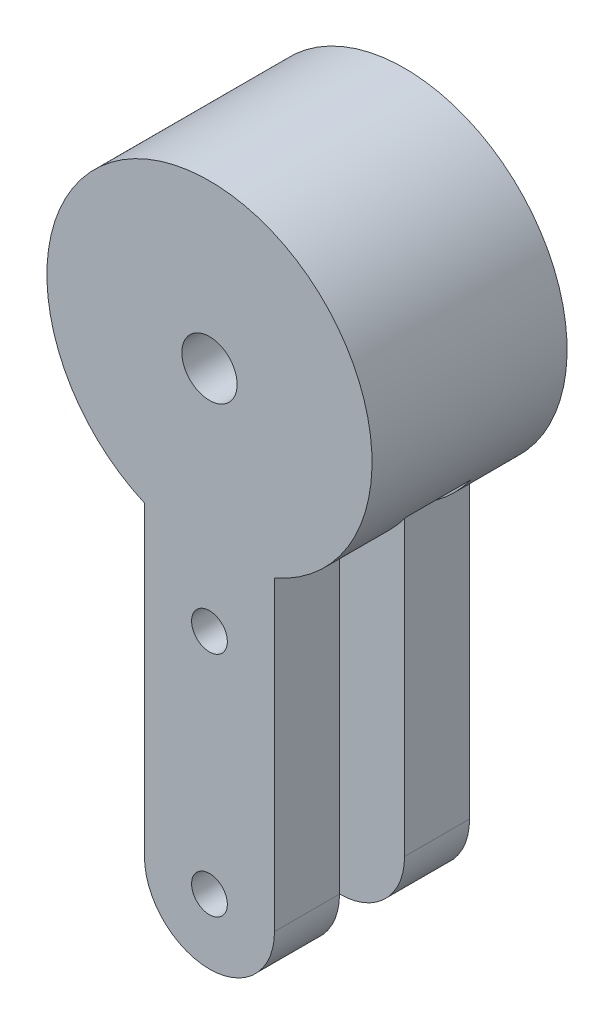
ISO-10303-21;
HEADER;
FILE_DESCRIPTION(('STEP AP214'),'2;1');
FILE_NAME('part.step','',(''),(''),'','','');
FILE_SCHEMA(('AUTOMOTIVE_DESIGN { 1 0 10303 214 1 1 1 1 }'));
ENDSEC;
DATA;
#1=APPLICATION_CONTEXT('core data for automotive mechanical design processes');
#2=APPLICATION_PROTOCOL_DEFINITION('international standard','automotive_design',2000,#1);
#3=PRODUCT_CONTEXT('',#1,'mechanical');
#4=PRODUCT('Part','Part','',(#3));
#5=PRODUCT_RELATED_PRODUCT_CATEGORY('part','',(#4));
#6=PRODUCT_DEFINITION_FORMATION('','',#4);
#7=PRODUCT_DEFINITION_CONTEXT('part definition',#1,'design');
#8=PRODUCT_DEFINITION('design','',#6,#7);
#9=PRODUCT_DEFINITION_SHAPE('','',#8);
#10=(LENGTH_UNIT() NAMED_UNIT(*) SI_UNIT(.MILLI.,.METRE.));
#11=(NAMED_UNIT(*) PLANE_ANGLE_UNIT() SI_UNIT($,.RADIAN.));
#12=(NAMED_UNIT(*) SI_UNIT($,.STERADIAN.) SOLID_ANGLE_UNIT());
#13=UNCERTAINTY_MEASURE_WITH_UNIT(LENGTH_MEASURE(1.E-05),#10,'distance_accuracy_value','');
#14=(GEOMETRIC_REPRESENTATION_CONTEXT(3) GLOBAL_UNCERTAINTY_ASSIGNED_CONTEXT((#13)) GLOBAL_UNIT_ASSIGNED_CONTEXT((#10,
#11,#12)) REPRESENTATION_CONTEXT('',''));
#15=CARTESIAN_POINT('',(0.,0.,0.));
#16=DIRECTION('',(0.,0.,1.));
#17=DIRECTION('',(1.,0.,0.));
#18=AXIS2_PLACEMENT_3D('',#15,#16,#17);
#19=CARTESIAN_POINT('',(0.,260.,10.));
#20=DIRECTION('',(0.,0.,-1.));
#21=DIRECTION('',(-1.,0.,0.));
#22=AXIS2_PLACEMENT_3D('',#19,#20,#21);
#23=CYLINDRICAL_SURFACE('',#22,25.);
#24=CARTESIAN_POINT('',(0.,260.,-20.));
#25=DIRECTION('',(0.,0.,-1.));
#26=DIRECTION('',(-1.,0.,0.));
#27=AXIS2_PLACEMENT_3D('',#24,#25,#26);
#28=CIRCLE('',#27,25.);
#29=CARTESIAN_POINT('',(-9.99999999999997,237.087121525221,-20.));
#30=VERTEX_POINT('',#29);
#31=CARTESIAN_POINT('',(10.,237.087121525221,-20.));
#32=VERTEX_POINT('',#31);
#33=EDGE_CURVE('E125',#30,#32,#28,.T.);
#34=ORIENTED_EDGE('',*,*,#33,.F.);
#35=DIRECTION('',(0.,0.,1.));
#36=VECTOR('',#35,1.);
#37=CARTESIAN_POINT('',(-9.99999999999999,237.087121525221,-20.8));
#38=LINE('',#37,#36);
#39=CARTESIAN_POINT('',(-9.99999999999998,237.087121525221,-10.));
#40=VERTEX_POINT('',#39);
#41=EDGE_CURVE('E259',#30,#40,#38,.T.);
#42=ORIENTED_EDGE('',*,*,#41,.T.);
#43=CARTESIAN_POINT('',(0.,260.,-10.));
#44=DIRECTION('',(0.,0.,1.));
#45=DIRECTION('',(1.,0.,0.));
#46=AXIS2_PLACEMENT_3D('',#43,#44,#45);
#47=CIRCLE('',#46,25.);
#48=CARTESIAN_POINT('',(-20.2,245.270437888382,-10.));
#49=VERTEX_POINT('',#48);
#50=EDGE_CURVE('E274',#49,#40,#47,.T.);
#51=ORIENTED_EDGE('',*,*,#50,.F.);
#52=DIRECTION('',(0.,0.,1.));
#53=VECTOR('',#52,1.);
#54=CARTESIAN_POINT('',(-20.2,245.270437888382,-10.4));
#55=LINE('',#54,#53);
#56=CARTESIAN_POINT('',(-20.2,245.270437888382,0.));
#57=VERTEX_POINT('',#56);
#58=EDGE_CURVE('E161',#49,#57,#55,.T.);
#59=ORIENTED_EDGE('',*,*,#58,.T.);
#60=CARTESIAN_POINT('',(0.,260.,0.));
#61=DIRECTION('',(0.,0.,1.));
#62=DIRECTION('',(1.,0.,0.));
#63=AXIS2_PLACEMENT_3D('',#60,#61,#62);
#64=CIRCLE('',#63,25.);
#65=CARTESIAN_POINT('',(-9.99999999999999,237.087121525221,0.));
#66=VERTEX_POINT('',#65);
#67=EDGE_CURVE('E198',#57,#66,#64,.T.);
#68=ORIENTED_EDGE('',*,*,#67,.T.);
#69=DIRECTION('',(0.,0.,-1.));
#70=VECTOR('',#69,1.);
#71=CARTESIAN_POINT('',(-9.99999999999999,237.087121525221,10.));
#72=LINE('',#71,#70);
#73=CARTESIAN_POINT('',(-9.99999999999999,237.087121525221,10.));
#74=VERTEX_POINT('',#73);
#75=EDGE_CURVE('E186',#74,#66,#72,.T.);
#76=ORIENTED_EDGE('',*,*,#75,.F.);
#77=CARTESIAN_POINT('',(0.,260.,10.));
#78=DIRECTION('',(0.,0.,1.));
#79=DIRECTION('',(1.,0.,0.));
#80=AXIS2_PLACEMENT_3D('',#77,#78,#79);
#81=CIRCLE('',#80,25.);
#82=CARTESIAN_POINT('',(10.,237.087121525221,10.));
#83=VERTEX_POINT('',#82);
#84=EDGE_CURVE('E178',#83,#74,#81,.T.);
#85=ORIENTED_EDGE('',*,*,#84,.F.);
#86=DIRECTION('',(0.,0.,-1.));
#87=VECTOR('',#86,1.);
#88=CARTESIAN_POINT('',(10.,237.087121525221,10.));
#89=LINE('',#88,#87);
#90=CARTESIAN_POINT('',(10.,237.087121525221,0.));
#91=VERTEX_POINT('',#90);
#92=EDGE_CURVE('E209',#83,#91,#89,.T.);
#93=ORIENTED_EDGE('',*,*,#92,.T.);
#94=CARTESIAN_POINT('',(20.2,245.270437888382,0.));
#95=VERTEX_POINT('',#94);
#96=EDGE_CURVE('E199',#91,#95,#64,.T.);
#97=ORIENTED_EDGE('',*,*,#96,.T.);
#98=DIRECTION('',(0.,0.,1.));
#99=VECTOR('',#98,1.);
#100=CARTESIAN_POINT('',(20.2,245.270437888382,-10.4));
#101=LINE('',#100,#99);
#102=CARTESIAN_POINT('',(20.2,245.270437888382,-10.));
#103=VERTEX_POINT('',#102);
#104=EDGE_CURVE('E159',#103,#95,#101,.T.);
#105=ORIENTED_EDGE('',*,*,#104,.F.);
#106=CARTESIAN_POINT('',(0.,260.,-10.));
#107=DIRECTION('',(0.,0.,1.));
#108=DIRECTION('',(1.,0.,0.));
#109=AXIS2_PLACEMENT_3D('',#106,#107,#108);
#110=CIRCLE('',#109,25.);
#111=CARTESIAN_POINT('',(10.,237.087121525221,-10.));
#112=VERTEX_POINT('',#111);
#113=EDGE_CURVE('E144',#112,#103,#110,.T.);
#114=ORIENTED_EDGE('',*,*,#113,.F.);
#115=DIRECTION('',(0.,0.,1.));
#116=VECTOR('',#115,1.);
#117=CARTESIAN_POINT('',(10.,237.087121525221,-20.8));
#118=LINE('',#117,#116);
#119=EDGE_CURVE('E138',#32,#112,#118,.T.);
#120=ORIENTED_EDGE('',*,*,#119,.F.);
#121=EDGE_LOOP('',(#34,#42,#51,#59,#68,#76,#85,#93,#97,#105,#114,#120));
#122=FACE_BOUND('',#121,.T.);
#123=ADVANCED_FACE('F35',(#122),#23,.T.);
#124=CARTESIAN_POINT('',(10.0000000000001,0.,-20.8));
#125=DIRECTION('',(-1.,0.,0.));
#126=DIRECTION('',(0.,-1.,0.));
#127=AXIS2_PLACEMENT_3D('',#124,#125,#126);
#128=PLANE('',#127);
#129=DIRECTION('',(0.,-1.,0.));
#130=VECTOR('',#129,1.);
#131=CARTESIAN_POINT('',(10.,237.087121525221,-20.));
#132=LINE('',#131,#130);
#133=CARTESIAN_POINT('',(10.,190.,-20.));
#134=VERTEX_POINT('',#133);
#135=EDGE_CURVE('E128',#32,#134,#132,.T.);
#136=ORIENTED_EDGE('',*,*,#135,.F.);
#137=ORIENTED_EDGE('',*,*,#119,.T.);
#138=DIRECTION('',(0.,1.,0.));
#139=VECTOR('',#138,1.);
#140=CARTESIAN_POINT('',(10.,190.,-10.));
#141=LINE('',#140,#139);
#142=CARTESIAN_POINT('',(10.,190.,-10.));
#143=VERTEX_POINT('',#142);
#144=EDGE_CURVE('E253',#143,#112,#141,.T.);
#145=ORIENTED_EDGE('',*,*,#144,.F.);
#146=DIRECTION('',(0.,0.,1.));
#147=VECTOR('',#146,1.);
#148=CARTESIAN_POINT('',(10.,190.,-20.8));
#149=LINE('',#148,#147);
#150=EDGE_CURVE('E140',#134,#143,#149,.T.);
#151=ORIENTED_EDGE('',*,*,#150,.F.);
#152=EDGE_LOOP('',(#136,#137,#145,#151));
#153=FACE_BOUND('',#152,.T.);
#154=ADVANCED_FACE('F136',(#153),#128,.F.);
#155=CARTESIAN_POINT('',(0.,190.,-20.8));
#156=DIRECTION('',(0.,0.,1.));
#157=DIRECTION('',(1.,0.,0.));
#158=AXIS2_PLACEMENT_3D('',#155,#156,#157);
#159=CYLINDRICAL_SURFACE('',#158,10.);
#160=CARTESIAN_POINT('',(0.,190.,-20.));
#161=DIRECTION('',(0.,0.,-1.));
#162=DIRECTION('',(-1.,0.,0.));
#163=AXIS2_PLACEMENT_3D('',#160,#161,#162);
#164=CIRCLE('',#163,10.);
#165=CARTESIAN_POINT('',(-9.99999999999999,190.,-20.));
#166=VERTEX_POINT('',#165);
#167=EDGE_CURVE('E51',#134,#166,#164,.T.);
#168=ORIENTED_EDGE('',*,*,#167,.F.);
#169=ORIENTED_EDGE('',*,*,#150,.T.);
#170=CARTESIAN_POINT('',(0.,190.,-10.));
#171=DIRECTION('',(0.,0.,1.));
#172=DIRECTION('',(1.,0.,0.));
#173=AXIS2_PLACEMENT_3D('',#170,#171,#172);
#174=CIRCLE('',#173,10.);
#175=CARTESIAN_POINT('',(-9.99999999999999,190.,-10.));
#176=VERTEX_POINT('',#175);
#177=EDGE_CURVE('E272',#176,#143,#174,.T.);
#178=ORIENTED_EDGE('',*,*,#177,.F.);
#179=DIRECTION('',(0.,0.,1.));
#180=VECTOR('',#179,1.);
#181=CARTESIAN_POINT('',(-9.99999999999999,190.,-20.8));
#182=LINE('',#181,#180);
#183=EDGE_CURVE('E149',#166,#176,#182,.T.);
#184=ORIENTED_EDGE('',*,*,#183,.F.);
#185=EDGE_LOOP('',(#168,#169,#178,#184));
#186=FACE_BOUND('',#185,.T.);
#187=ADVANCED_FACE('F276',(#186),#159,.T.);
#188=CARTESIAN_POINT('',(-9.99999999999999,0.,-20.8));
#189=DIRECTION('',(1.,0.,0.));
#190=DIRECTION('',(0.,0.,-1.));
#191=AXIS2_PLACEMENT_3D('',#188,#189,#190);
#192=PLANE('',#191);
#193=DIRECTION('',(0.,1.,0.));
#194=VECTOR('',#193,1.);
#195=CARTESIAN_POINT('',(-9.99999999999999,190.,-20.));
#196=LINE('',#195,#194);
#197=EDGE_CURVE('E129',#166,#30,#196,.T.);
#198=ORIENTED_EDGE('',*,*,#197,.F.);
#199=ORIENTED_EDGE('',*,*,#183,.T.);
#200=DIRECTION('',(0.,-1.,0.));
#201=VECTOR('',#200,1.);
#202=CARTESIAN_POINT('',(-9.99999999999998,237.087121525221,-10.));
#203=LINE('',#202,#201);
#204=EDGE_CURVE('E265',#40,#176,#203,.T.);
#205=ORIENTED_EDGE('',*,*,#204,.F.);
#206=ORIENTED_EDGE('',*,*,#41,.F.);
#207=EDGE_LOOP('',(#198,#199,#205,#206));
#208=FACE_BOUND('',#207,.T.);
#209=ADVANCED_FACE('F264',(#208),#192,.F.);
#210=CARTESIAN_POINT('',(0.,260.,-20.8));
#211=DIRECTION('',(0.,0.,1.));
#212=DIRECTION('',(1.,0.,0.));
#213=AXIS2_PLACEMENT_3D('',#210,#211,#212);
#214=CYLINDRICAL_SURFACE('',#213,4.25);
#215=CARTESIAN_POINT('',(0.,260.,-10.));
#216=DIRECTION('',(0.,0.,1.));
#217=DIRECTION('',(1.,0.,0.));
#218=AXIS2_PLACEMENT_3D('',#215,#216,#217);
#219=CIRCLE('',#218,4.25);
#220=CARTESIAN_POINT('',(4.25,260.,-10.));
#221=VERTEX_POINT('',#220);
#222=EDGE_CURVE('E282',#221,#221,#219,.T.);
#223=ORIENTED_EDGE('',*,*,#222,.T.);
#224=EDGE_LOOP('',(#223));
#225=FACE_BOUND('',#224,.T.);
#226=CARTESIAN_POINT('',(0.,260.,-20.));
#227=DIRECTION('',(0.,0.,-1.));
#228=DIRECTION('',(-1.,0.,0.));
#229=AXIS2_PLACEMENT_3D('',#226,#227,#228);
#230=CIRCLE('',#229,4.25);
#231=CARTESIAN_POINT('',(-4.25,260.,-20.));
#232=VERTEX_POINT('',#231);
#233=EDGE_CURVE('E285',#232,#232,#230,.T.);
#234=ORIENTED_EDGE('',*,*,#233,.T.);
#235=EDGE_LOOP('',(#234));
#236=FACE_BOUND('',#235,.T.);
#237=ADVANCED_FACE('F326',(#225,#236),#214,.F.);
#238=CARTESIAN_POINT('',(-9.99999999999997,0.,10.));
#239=DIRECTION('',(1.,0.,0.));
#240=DIRECTION('',(0.,1.,0.));
#241=AXIS2_PLACEMENT_3D('',#238,#239,#240);
#242=PLANE('',#241);
#243=DIRECTION('',(0.,-1.,0.));
#244=VECTOR('',#243,1.);
#245=CARTESIAN_POINT('',(-9.99999999999997,0.,0.));
#246=LINE('',#245,#244);
#247=CARTESIAN_POINT('',(-9.99999999999999,190.,0.));
#248=VERTEX_POINT('',#247);
#249=EDGE_CURVE('E189',#66,#248,#246,.T.);
#250=ORIENTED_EDGE('',*,*,#249,.T.);
#251=DIRECTION('',(0.,0.,-1.));
#252=VECTOR('',#251,1.);
#253=CARTESIAN_POINT('',(-9.99999999999999,190.,10.));
#254=LINE('',#253,#252);
#255=CARTESIAN_POINT('',(-9.99999999999999,190.,10.));
#256=VERTEX_POINT('',#255);
#257=EDGE_CURVE('E11',#256,#248,#254,.T.);
#258=ORIENTED_EDGE('',*,*,#257,.F.);
#259=DIRECTION('',(0.,-1.,0.));
#260=VECTOR('',#259,1.);
#261=CARTESIAN_POINT('',(-9.99999999999997,0.,10.));
#262=LINE('',#261,#260);
#263=EDGE_CURVE('E169',#74,#256,#262,.T.);
#264=ORIENTED_EDGE('',*,*,#263,.F.);
#265=ORIENTED_EDGE('',*,*,#75,.T.);
#266=EDGE_LOOP('',(#250,#258,#264,#265));
#267=FACE_BOUND('',#266,.T.);
#268=ADVANCED_FACE('F232',(#267),#242,.F.);
#269=CARTESIAN_POINT('',(0.,190.,10.));
#270=DIRECTION('',(0.,0.,-1.));
#271=DIRECTION('',(-1.,0.,0.));
#272=AXIS2_PLACEMENT_3D('',#269,#270,#271);
#273=CYLINDRICAL_SURFACE('',#272,10.);
#274=CARTESIAN_POINT('',(0.,190.,0.));
#275=DIRECTION('',(0.,0.,1.));
#276=DIRECTION('',(1.,0.,0.));
#277=AXIS2_PLACEMENT_3D('',#274,#275,#276);
#278=CIRCLE('',#277,10.);
#279=CARTESIAN_POINT('',(10.,190.,0.));
#280=VERTEX_POINT('',#279);
#281=EDGE_CURVE('E192',#248,#280,#278,.T.);
#282=ORIENTED_EDGE('',*,*,#281,.T.);
#283=DIRECTION('',(0.,0.,-1.));
#284=VECTOR('',#283,1.);
#285=CARTESIAN_POINT('',(10.,190.,10.));
#286=LINE('',#285,#284);
#287=CARTESIAN_POINT('',(10.,190.,10.));
#288=VERTEX_POINT('',#287);
#289=EDGE_CURVE('E44',#288,#280,#286,.T.);
#290=ORIENTED_EDGE('',*,*,#289,.F.);
#291=CARTESIAN_POINT('',(0.,190.,10.));
#292=DIRECTION('',(0.,0.,1.));
#293=DIRECTION('',(1.,0.,0.));
#294=AXIS2_PLACEMENT_3D('',#291,#292,#293);
#295=CIRCLE('',#294,10.);
#296=EDGE_CURVE('E173',#256,#288,#295,.T.);
#297=ORIENTED_EDGE('',*,*,#296,.F.);
#298=ORIENTED_EDGE('',*,*,#257,.T.);
#299=EDGE_LOOP('',(#282,#290,#297,#298));
#300=FACE_BOUND('',#299,.T.);
#301=ADVANCED_FACE('F217',(#300),#273,.T.);
#302=CARTESIAN_POINT('',(10.,0.,10.));
#303=DIRECTION('',(1.,0.,0.));
#304=DIRECTION('',(0.,1.,0.));
#305=AXIS2_PLACEMENT_3D('',#302,#303,#304);
#306=PLANE('',#305);
#307=DIRECTION('',(0.,-1.,0.));
#308=VECTOR('',#307,1.);
#309=CARTESIAN_POINT('',(10.,0.,0.));
#310=LINE('',#309,#308);
#311=EDGE_CURVE('E195',#91,#280,#310,.T.);
#312=ORIENTED_EDGE('',*,*,#311,.F.);
#313=ORIENTED_EDGE('',*,*,#92,.F.);
#314=DIRECTION('',(0.,-1.,0.));
#315=VECTOR('',#314,1.);
#316=CARTESIAN_POINT('',(10.,0.,10.));
#317=LINE('',#316,#315);
#318=EDGE_CURVE('E175',#83,#288,#317,.T.);
#319=ORIENTED_EDGE('',*,*,#318,.T.);
#320=ORIENTED_EDGE('',*,*,#289,.T.);
#321=EDGE_LOOP('',(#312,#313,#319,#320));
#322=FACE_BOUND('',#321,.T.);
#323=ADVANCED_FACE('F214',(#322),#306,.T.);
#324=CARTESIAN_POINT('',(0.,260.,10.));
#325=DIRECTION('',(0.,0.,-1.));
#326=DIRECTION('',(-1.,0.,0.));
#327=AXIS2_PLACEMENT_3D('',#324,#325,#326);
#328=CYLINDRICAL_SURFACE('',#327,4.25);
#329=CARTESIAN_POINT('',(0.,260.,10.));
#330=DIRECTION('',(0.,0.,1.));
#331=DIRECTION('',(1.,0.,0.));
#332=AXIS2_PLACEMENT_3D('',#329,#330,#331);
#333=CIRCLE('',#332,4.25);
#334=CARTESIAN_POINT('',(4.25,260.,10.));
#335=VERTEX_POINT('',#334);
#336=EDGE_CURVE('E180',#335,#335,#333,.T.);
#337=ORIENTED_EDGE('',*,*,#336,.T.);
#338=EDGE_LOOP('',(#337));
#339=FACE_BOUND('',#338,.T.);
#340=CARTESIAN_POINT('',(0.,260.,0.));
#341=DIRECTION('',(0.,0.,1.));
#342=DIRECTION('',(1.,0.,0.));
#343=AXIS2_PLACEMENT_3D('',#340,#341,#342);
#344=CIRCLE('',#343,4.25);
#345=CARTESIAN_POINT('',(4.25,260.,0.));
#346=VERTEX_POINT('',#345);
#347=EDGE_CURVE('E202',#346,#346,#344,.T.);
#348=ORIENTED_EDGE('',*,*,#347,.F.);
#349=EDGE_LOOP('',(#348));
#350=FACE_BOUND('',#349,.T.);
#351=ADVANCED_FACE('F320',(#339,#350),#328,.F.);
#352=CARTESIAN_POINT('',(0.,225.,10.));
#353=DIRECTION('',(0.,0.,-1.));
#354=DIRECTION('',(-1.,0.,0.));
#355=AXIS2_PLACEMENT_3D('',#352,#353,#354);
#356=CYLINDRICAL_SURFACE('',#355,2.75);
#357=CARTESIAN_POINT('',(0.,225.,10.));
#358=DIRECTION('',(0.,0.,1.));
#359=DIRECTION('',(1.,0.,0.));
#360=AXIS2_PLACEMENT_3D('',#357,#358,#359);
#361=CIRCLE('',#360,2.75);
#362=CARTESIAN_POINT('',(2.75,225.,10.));
#363=VERTEX_POINT('',#362);
#364=EDGE_CURVE('E166',#363,#363,#361,.T.);
#365=ORIENTED_EDGE('',*,*,#364,.T.);
#366=EDGE_LOOP('',(#365));
#367=FACE_BOUND('',#366,.T.);
#368=CARTESIAN_POINT('',(0.,225.,0.));
#369=DIRECTION('',(0.,0.,1.));
#370=DIRECTION('',(1.,0.,0.));
#371=AXIS2_PLACEMENT_3D('',#368,#369,#370);
#372=CIRCLE('',#371,2.75);
#373=CARTESIAN_POINT('',(2.75,225.,0.));
#374=VERTEX_POINT('',#373);
#375=EDGE_CURVE('E165',#374,#374,#372,.T.);
#376=ORIENTED_EDGE('',*,*,#375,.F.);
#377=EDGE_LOOP('',(#376));
#378=FACE_BOUND('',#377,.T.);
#379=ADVANCED_FACE('F37',(#367,#378),#356,.F.);
#380=CARTESIAN_POINT('',(0.,190.,10.));
#381=DIRECTION('',(0.,0.,-1.));
#382=DIRECTION('',(-1.,0.,0.));
#383=AXIS2_PLACEMENT_3D('',#380,#381,#382);
#384=CYLINDRICAL_SURFACE('',#383,2.75);
#385=CARTESIAN_POINT('',(0.,190.,10.));
#386=DIRECTION('',(0.,0.,1.));
#387=DIRECTION('',(1.,0.,0.));
#388=AXIS2_PLACEMENT_3D('',#385,#386,#387);
#389=CIRCLE('',#388,2.75);
#390=CARTESIAN_POINT('',(2.75000000000001,190.,10.));
#391=VERTEX_POINT('',#390);
#392=EDGE_CURVE('E183',#391,#391,#389,.T.);
#393=ORIENTED_EDGE('',*,*,#392,.T.);
#394=EDGE_LOOP('',(#393));
#395=FACE_BOUND('',#394,.T.);
#396=CARTESIAN_POINT('',(0.,190.,0.));
#397=DIRECTION('',(0.,0.,1.));
#398=DIRECTION('',(1.,0.,0.));
#399=AXIS2_PLACEMENT_3D('',#396,#397,#398);
#400=CIRCLE('',#399,2.75);
#401=CARTESIAN_POINT('',(2.75000000000001,190.,0.));
#402=VERTEX_POINT('',#401);
#403=EDGE_CURVE('E170',#402,#402,#400,.T.);
#404=ORIENTED_EDGE('',*,*,#403,.F.);
#405=EDGE_LOOP('',(#404));
#406=FACE_BOUND('',#405,.T.);
#407=ADVANCED_FACE('F354',(#395,#406),#384,.F.);
#408=CARTESIAN_POINT('',(0.,0.,10.));
#409=DIRECTION('',(0.,0.,1.));
#410=DIRECTION('',(1.,0.,0.));
#411=AXIS2_PLACEMENT_3D('',#408,#409,#410);
#412=PLANE('',#411);
#413=ORIENTED_EDGE('',*,*,#364,.F.);
#414=EDGE_LOOP('',(#413));
#415=FACE_BOUND('',#414,.T.);
#416=ORIENTED_EDGE('',*,*,#263,.T.);
#417=ORIENTED_EDGE('',*,*,#296,.T.);
#418=ORIENTED_EDGE('',*,*,#318,.F.);
#419=ORIENTED_EDGE('',*,*,#84,.T.);
#420=EDGE_LOOP('',(#416,#417,#418,#419));
#421=FACE_BOUND('',#420,.T.);
#422=ORIENTED_EDGE('',*,*,#336,.F.);
#423=EDGE_LOOP('',(#422));
#424=FACE_BOUND('',#423,.T.);
#425=ORIENTED_EDGE('',*,*,#392,.F.);
#426=EDGE_LOOP('',(#425));
#427=FACE_BOUND('',#426,.T.);
#428=ADVANCED_FACE('F229',(#415,#421,#424,#427),#412,.T.);
#429=CARTESIAN_POINT('',(0.,0.,0.));
#430=DIRECTION('',(0.,0.,1.));
#431=DIRECTION('',(1.,0.,0.));
#432=AXIS2_PLACEMENT_3D('',#429,#430,#431);
#433=PLANE('',#432);
#434=ORIENTED_EDGE('',*,*,#375,.T.);
#435=EDGE_LOOP('',(#434));
#436=FACE_BOUND('',#435,.T.);
#437=CARTESIAN_POINT('',(0.,260.,0.));
#438=DIRECTION('',(0.,0.,-1.));
#439=DIRECTION('',(-1.,0.,0.));
#440=AXIS2_PLACEMENT_3D('',#437,#438,#439);
#441=CIRCLE('',#440,20.2);
#442=CARTESIAN_POINT('',(-20.2,260.,0.));
#443=VERTEX_POINT('',#442);
#444=CARTESIAN_POINT('',(20.2,260.,0.));
#445=VERTEX_POINT('',#444);
#446=EDGE_CURVE('E145',#443,#445,#441,.T.);
#447=ORIENTED_EDGE('',*,*,#446,.T.);
#448=DIRECTION('',(0.,-1.,0.));
#449=VECTOR('',#448,1.);
#450=CARTESIAN_POINT('',(20.1999999999999,0.,0.));
#451=LINE('',#450,#449);
#452=EDGE_CURVE('E155',#445,#95,#451,.T.);
#453=ORIENTED_EDGE('',*,*,#452,.T.);
#454=ORIENTED_EDGE('',*,*,#96,.F.);
#455=ORIENTED_EDGE('',*,*,#311,.T.);
#456=ORIENTED_EDGE('',*,*,#281,.F.);
#457=ORIENTED_EDGE('',*,*,#249,.F.);
#458=ORIENTED_EDGE('',*,*,#67,.F.);
#459=DIRECTION('',(0.,-1.,0.));
#460=VECTOR('',#459,1.);
#461=CARTESIAN_POINT('',(-20.1999999999999,0.,0.));
#462=LINE('',#461,#460);
#463=EDGE_CURVE('E147',#443,#57,#462,.T.);
#464=ORIENTED_EDGE('',*,*,#463,.F.);
#465=EDGE_LOOP('',(#447,#453,#454,#455,#456,#457,#458,#464));
#466=FACE_BOUND('',#465,.T.);
#467=ORIENTED_EDGE('',*,*,#347,.T.);
#468=EDGE_LOOP('',(#467));
#469=FACE_BOUND('',#468,.T.);
#470=ORIENTED_EDGE('',*,*,#403,.T.);
#471=EDGE_LOOP('',(#470));
#472=FACE_BOUND('',#471,.T.);
#473=ADVANCED_FACE('F222',(#436,#466,#469,#472),#433,.F.);
#474=CARTESIAN_POINT('',(0.,260.,-10.4));
#475=DIRECTION('',(0.,0.,1.));
#476=DIRECTION('',(1.,0.,0.));
#477=AXIS2_PLACEMENT_3D('',#474,#475,#476);
#478=CYLINDRICAL_SURFACE('',#477,20.2);
#479=CARTESIAN_POINT('',(0.,260.,-10.));
#480=DIRECTION('',(0.,0.,1.));
#481=DIRECTION('',(1.,0.,0.));
#482=AXIS2_PLACEMENT_3D('',#479,#480,#481);
#483=CIRCLE('',#482,20.2);
#484=CARTESIAN_POINT('',(20.2,260.,-10.));
#485=VERTEX_POINT('',#484);
#486=CARTESIAN_POINT('',(-20.2,260.,-10.));
#487=VERTEX_POINT('',#486);
#488=EDGE_CURVE('E242',#485,#487,#483,.T.);
#489=ORIENTED_EDGE('',*,*,#488,.F.);
#490=DIRECTION('',(0.,0.,1.));
#491=VECTOR('',#490,1.);
#492=CARTESIAN_POINT('',(20.2,260.,-10.4));
#493=LINE('',#492,#491);
#494=EDGE_CURVE('E59',#485,#445,#493,.T.);
#495=ORIENTED_EDGE('',*,*,#494,.T.);
#496=ORIENTED_EDGE('',*,*,#446,.F.);
#497=DIRECTION('',(0.,0.,1.));
#498=VECTOR('',#497,1.);
#499=CARTESIAN_POINT('',(-20.2,260.,-10.4));
#500=LINE('',#499,#498);
#501=EDGE_CURVE('E163',#487,#443,#500,.T.);
#502=ORIENTED_EDGE('',*,*,#501,.F.);
#503=EDGE_LOOP('',(#489,#495,#496,#502));
#504=FACE_BOUND('',#503,.T.);
#505=ADVANCED_FACE('F241',(#504),#478,.F.);
#506=CARTESIAN_POINT('',(-20.1999999999999,0.,-10.4));
#507=DIRECTION('',(-1.,0.,0.));
#508=DIRECTION('',(0.,-1.,0.));
#509=AXIS2_PLACEMENT_3D('',#506,#507,#508);
#510=PLANE('',#509);
#511=ORIENTED_EDGE('',*,*,#58,.F.);
#512=DIRECTION('',(0.,-1.,0.));
#513=VECTOR('',#512,1.);
#514=CARTESIAN_POINT('',(-20.2,260.,-10.));
#515=LINE('',#514,#513);
#516=EDGE_CURVE('E240',#487,#49,#515,.T.);
#517=ORIENTED_EDGE('',*,*,#516,.F.);
#518=ORIENTED_EDGE('',*,*,#501,.T.);
#519=ORIENTED_EDGE('',*,*,#463,.T.);
#520=EDGE_LOOP('',(#511,#517,#518,#519));
#521=FACE_BOUND('',#520,.T.);
#522=ADVANCED_FACE('F237',(#521),#510,.F.);
#523=CARTESIAN_POINT('',(20.1999999999999,0.,-10.4));
#524=DIRECTION('',(-1.,0.,0.));
#525=DIRECTION('',(0.,-1.,0.));
#526=AXIS2_PLACEMENT_3D('',#523,#524,#525);
#527=PLANE('',#526);
#528=DIRECTION('',(0.,1.,0.));
#529=VECTOR('',#528,1.);
#530=CARTESIAN_POINT('',(20.2,245.270437888382,-10.));
#531=LINE('',#530,#529);
#532=EDGE_CURVE('E246',#103,#485,#531,.T.);
#533=ORIENTED_EDGE('',*,*,#532,.F.);
#534=ORIENTED_EDGE('',*,*,#104,.T.);
#535=ORIENTED_EDGE('',*,*,#452,.F.);
#536=ORIENTED_EDGE('',*,*,#494,.F.);
#537=EDGE_LOOP('',(#533,#534,#535,#536));
#538=FACE_BOUND('',#537,.T.);
#539=ADVANCED_FACE('F245',(#538),#527,.T.);
#540=CARTESIAN_POINT('',(0.,260.,-10.));
#541=DIRECTION('',(0.,0.,1.));
#542=DIRECTION('',(1.,0.,0.));
#543=AXIS2_PLACEMENT_3D('',#540,#541,#542);
#544=PLANE('',#543);
#545=ORIENTED_EDGE('',*,*,#488,.T.);
#546=ORIENTED_EDGE('',*,*,#516,.T.);
#547=ORIENTED_EDGE('',*,*,#50,.T.);
#548=ORIENTED_EDGE('',*,*,#204,.T.);
#549=ORIENTED_EDGE('',*,*,#177,.T.);
#550=ORIENTED_EDGE('',*,*,#144,.T.);
#551=ORIENTED_EDGE('',*,*,#113,.T.);
#552=ORIENTED_EDGE('',*,*,#532,.T.);
#553=EDGE_LOOP('',(#545,#546,#547,#548,#549,#550,#551,#552));
#554=FACE_BOUND('',#553,.T.);
#555=ORIENTED_EDGE('',*,*,#222,.F.);
#556=EDGE_LOOP('',(#555));
#557=FACE_BOUND('',#556,.T.);
#558=ADVANCED_FACE('F270',(#554,#557),#544,.T.);
#559=CARTESIAN_POINT('',(0.,260.,-20.));
#560=DIRECTION('',(0.,0.,-1.));
#561=DIRECTION('',(-1.,0.,0.));
#562=AXIS2_PLACEMENT_3D('',#559,#560,#561);
#563=PLANE('',#562);
#564=ORIENTED_EDGE('',*,*,#233,.F.);
#565=EDGE_LOOP('',(#564));
#566=FACE_BOUND('',#565,.T.);
#567=CARTESIAN_POINT('',(0.,190.,-20.));
#568=DIRECTION('',(0.,0.,-1.));
#569=DIRECTION('',(-1.,0.,0.));
#570=AXIS2_PLACEMENT_3D('',#567,#568,#569);
#571=CIRCLE('',#570,2.75);
#572=CARTESIAN_POINT('',(-2.74999999999999,190.,-20.));
#573=VERTEX_POINT('',#572);
#574=EDGE_CURVE('E288',#573,#573,#571,.T.);
#575=ORIENTED_EDGE('',*,*,#574,.F.);
#576=EDGE_LOOP('',(#575));
#577=FACE_BOUND('',#576,.T.);
#578=CARTESIAN_POINT('',(0.,225.,-20.));
#579=DIRECTION('',(0.,0.,-1.));
#580=DIRECTION('',(-1.,0.,0.));
#581=AXIS2_PLACEMENT_3D('',#578,#579,#580);
#582=CIRCLE('',#581,2.75);
#583=CARTESIAN_POINT('',(-2.75,225.,-20.));
#584=VERTEX_POINT('',#583);
#585=EDGE_CURVE('E39',#584,#584,#582,.T.);
#586=ORIENTED_EDGE('',*,*,#585,.F.);
#587=EDGE_LOOP('',(#586));
#588=FACE_BOUND('',#587,.T.);
#589=ORIENTED_EDGE('',*,*,#33,.T.);
#590=ORIENTED_EDGE('',*,*,#135,.T.);
#591=ORIENTED_EDGE('',*,*,#167,.T.);
#592=ORIENTED_EDGE('',*,*,#197,.T.);
#593=EDGE_LOOP('',(#589,#590,#591,#592));
#594=FACE_BOUND('',#593,.T.);
#595=ADVANCED_FACE('F127',(#566,#577,#588,#594),#563,.T.);
#596=CARTESIAN_POINT('',(0.,260.,-10.4));
#597=DIRECTION('',(0.,0.,1.));
#598=DIRECTION('',(1.,0.,0.));
#599=AXIS2_PLACEMENT_3D('',#596,#597,#598);
#600=PLANE('',#599);
#601=CARTESIAN_POINT('',(0.,190.,-10.4));
#602=DIRECTION('',(0.,0.,-1.));
#603=DIRECTION('',(-1.,0.,0.));
#604=AXIS2_PLACEMENT_3D('',#601,#602,#603);
#605=CIRCLE('',#604,2.75);
#606=CARTESIAN_POINT('',(-2.74999999999999,190.,-10.4));
#607=VERTEX_POINT('',#606);
#608=EDGE_CURVE('E248',#607,#607,#605,.T.);
#609=ORIENTED_EDGE('',*,*,#608,.T.);
#610=EDGE_LOOP('',(#609));
#611=FACE_BOUND('',#610,.T.);
#612=ADVANCED_FACE('F298',(#611),#600,.F.);
#613=CARTESIAN_POINT('',(0.,190.,-20.8));
#614=DIRECTION('',(0.,0.,1.));
#615=DIRECTION('',(1.,0.,0.));
#616=AXIS2_PLACEMENT_3D('',#613,#614,#615);
#617=CYLINDRICAL_SURFACE('',#616,2.75);
#618=ORIENTED_EDGE('',*,*,#608,.F.);
#619=EDGE_LOOP('',(#618));
#620=FACE_BOUND('',#619,.T.);
#621=ORIENTED_EDGE('',*,*,#574,.T.);
#622=EDGE_LOOP('',(#621));
#623=FACE_BOUND('',#622,.T.);
#624=ADVANCED_FACE('F305',(#620,#623),#617,.F.);
#625=CARTESIAN_POINT('',(0.,225.,-10.4));
#626=DIRECTION('',(0.,0.,-1.));
#627=DIRECTION('',(-1.,0.,0.));
#628=AXIS2_PLACEMENT_3D('',#625,#626,#627);
#629=CIRCLE('',#628,2.75);
#630=CARTESIAN_POINT('',(-2.75,225.,-10.4));
#631=VERTEX_POINT('',#630);
#632=EDGE_CURVE('E251',#631,#631,#629,.T.);
#633=ORIENTED_EDGE('',*,*,#632,.T.);
#634=EDGE_LOOP('',(#633));
#635=FACE_BOUND('',#634,.T.);
#636=ADVANCED_FACE('F308',(#635),#600,.F.);
#637=CARTESIAN_POINT('',(0.,225.,-20.8));
#638=DIRECTION('',(0.,0.,1.));
#639=DIRECTION('',(1.,0.,0.));
#640=AXIS2_PLACEMENT_3D('',#637,#638,#639);
#641=CYLINDRICAL_SURFACE('',#640,2.75);
#642=ORIENTED_EDGE('',*,*,#632,.F.);
#643=EDGE_LOOP('',(#642));
#644=FACE_BOUND('',#643,.T.);
#645=ORIENTED_EDGE('',*,*,#585,.T.);
#646=EDGE_LOOP('',(#645));
#647=FACE_BOUND('',#646,.T.);
#648=ADVANCED_FACE('F295',(#644,#647),#641,.F.);
#649=CLOSED_SHELL('',(#123,#154,#187,#209,#237,#268,#301,#323,#351,#379,#407,#428,#473,#505,
#522,#539,#558,#595,#612,#624,#636,#648));
#650=MANIFOLD_SOLID_BREP('B2',#649);
#651=ADVANCED_BREP_SHAPE_REPRESENTATION('',(#18,#650),#14);
#652=SHAPE_DEFINITION_REPRESENTATION(#9,#651);
ENDSEC;
END-ISO-10303-21;
